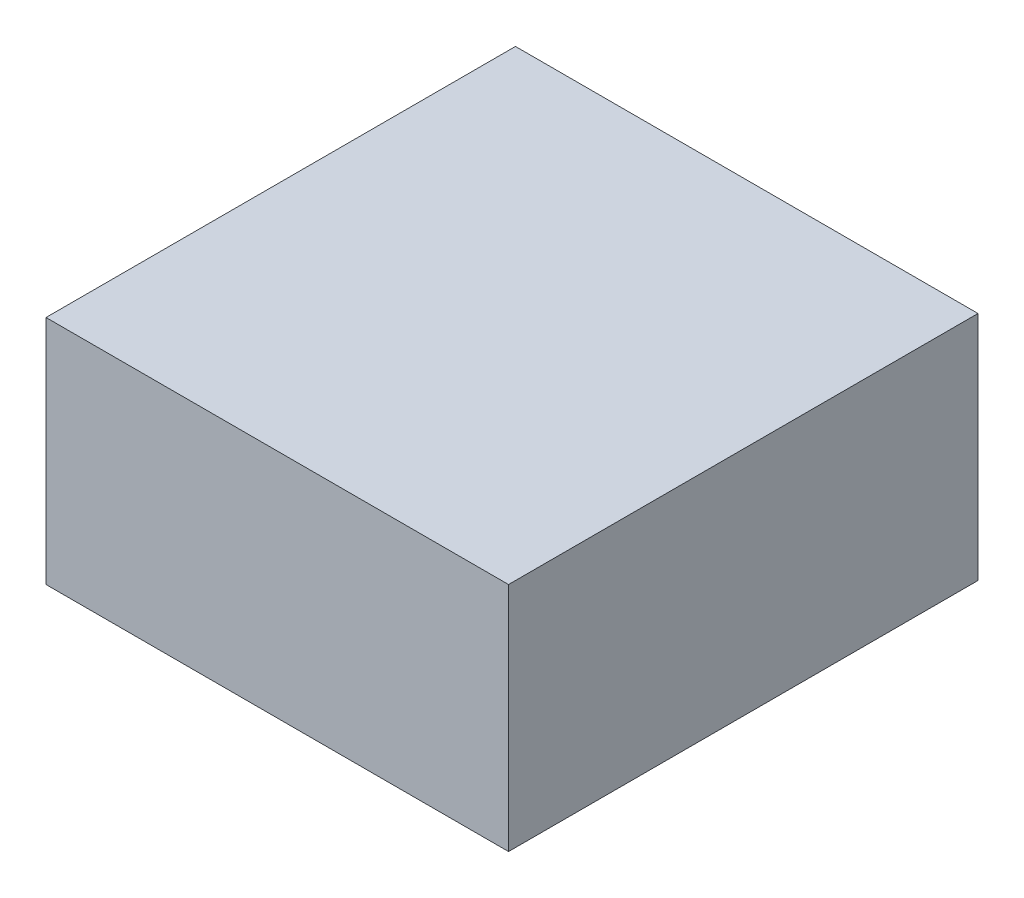
ISO-10303-21;
HEADER;
FILE_DESCRIPTION(('STEP AP214'),'2;1');
FILE_NAME('part.step','',(''),(''),'','','');
FILE_SCHEMA(('AUTOMOTIVE_DESIGN { 1 0 10303 214 1 1 1 1 }'));
ENDSEC;
DATA;
#1=APPLICATION_CONTEXT('core data for automotive mechanical design processes');
#2=APPLICATION_PROTOCOL_DEFINITION('international standard','automotive_design',2000,#1);
#3=PRODUCT_CONTEXT('',#1,'mechanical');
#4=PRODUCT('Part','Part','',(#3));
#5=PRODUCT_RELATED_PRODUCT_CATEGORY('part','',(#4));
#6=PRODUCT_DEFINITION_FORMATION('','',#4);
#7=PRODUCT_DEFINITION_CONTEXT('part definition',#1,'design');
#8=PRODUCT_DEFINITION('design','',#6,#7);
#9=PRODUCT_DEFINITION_SHAPE('','',#8);
#10=(LENGTH_UNIT() NAMED_UNIT(*) SI_UNIT(.MILLI.,.METRE.));
#11=(NAMED_UNIT(*) PLANE_ANGLE_UNIT() SI_UNIT($,.RADIAN.));
#12=(NAMED_UNIT(*) SI_UNIT($,.STERADIAN.) SOLID_ANGLE_UNIT());
#13=UNCERTAINTY_MEASURE_WITH_UNIT(LENGTH_MEASURE(1.E-05),#10,'distance_accuracy_value','');
#14=(GEOMETRIC_REPRESENTATION_CONTEXT(3) GLOBAL_UNCERTAINTY_ASSIGNED_CONTEXT((#13)) GLOBAL_UNIT_ASSIGNED_CONTEXT((#10,
#11,#12)) REPRESENTATION_CONTEXT('',''));
#15=CARTESIAN_POINT('',(0.,0.,0.));
#16=DIRECTION('',(0.,0.,1.));
#17=DIRECTION('',(1.,0.,0.));
#18=AXIS2_PLACEMENT_3D('',#15,#16,#17);
#19=CARTESIAN_POINT('',(-100.,50.,203.));
#20=DIRECTION('',(1.,0.,0.));
#21=DIRECTION('',(0.,1.,0.));
#22=AXIS2_PLACEMENT_3D('',#19,#20,#21);
#23=PLANE('',#22);
#24=DIRECTION('',(0.,-1.,0.));
#25=VECTOR('',#24,1.);
#26=CARTESIAN_POINT('',(-100.,50.,0.));
#27=LINE('',#26,#25);
#28=CARTESIAN_POINT('',(-100.,50.,0.));
#29=VERTEX_POINT('',#28);
#30=CARTESIAN_POINT('',(-100.,-50.,0.));
#31=VERTEX_POINT('',#30);
#32=EDGE_CURVE('E102',#29,#31,#27,.T.);
#33=ORIENTED_EDGE('',*,*,#32,.T.);
#34=DIRECTION('',(0.,0.,-1.));
#35=VECTOR('',#34,1.);
#36=CARTESIAN_POINT('',(-100.,-50.,203.));
#37=LINE('',#36,#35);
#38=CARTESIAN_POINT('',(-100.,-50.,203.));
#39=VERTEX_POINT('',#38);
#40=EDGE_CURVE('E11',#39,#31,#37,.T.);
#41=ORIENTED_EDGE('',*,*,#40,.F.);
#42=DIRECTION('',(0.,-1.,0.));
#43=VECTOR('',#42,1.);
#44=CARTESIAN_POINT('',(-100.,50.,203.));
#45=LINE('',#44,#43);
#46=CARTESIAN_POINT('',(-100.,50.,203.));
#47=VERTEX_POINT('',#46);
#48=EDGE_CURVE('E90',#47,#39,#45,.T.);
#49=ORIENTED_EDGE('',*,*,#48,.F.);
#50=DIRECTION('',(0.,0.,-1.));
#51=VECTOR('',#50,1.);
#52=CARTESIAN_POINT('',(-100.,50.,203.));
#53=LINE('',#52,#51);
#54=EDGE_CURVE('E98',#47,#29,#53,.T.);
#55=ORIENTED_EDGE('',*,*,#54,.T.);
#56=EDGE_LOOP('',(#33,#41,#49,#55));
#57=FACE_BOUND('',#56,.T.);
#58=ADVANCED_FACE('F39',(#57),#23,.F.);
#59=CARTESIAN_POINT('',(-100.,-50.,203.));
#60=DIRECTION('',(0.,1.,0.));
#61=DIRECTION('',(0.,0.,1.));
#62=AXIS2_PLACEMENT_3D('',#59,#60,#61);
#63=PLANE('',#62);
#64=DIRECTION('',(1.,0.,0.));
#65=VECTOR('',#64,1.);
#66=CARTESIAN_POINT('',(-100.,-50.,0.));
#67=LINE('',#66,#65);
#68=CARTESIAN_POINT('',(100.,-50.,0.));
#69=VERTEX_POINT('',#68);
#70=EDGE_CURVE('E94',#31,#69,#67,.T.);
#71=ORIENTED_EDGE('',*,*,#70,.T.);
#72=DIRECTION('',(0.,0.,-1.));
#73=VECTOR('',#72,1.);
#74=CARTESIAN_POINT('',(100.,-50.,203.));
#75=LINE('',#74,#73);
#76=CARTESIAN_POINT('',(100.,-50.,203.));
#77=VERTEX_POINT('',#76);
#78=EDGE_CURVE('E47',#77,#69,#75,.T.);
#79=ORIENTED_EDGE('',*,*,#78,.F.);
#80=DIRECTION('',(1.,0.,0.));
#81=VECTOR('',#80,1.);
#82=CARTESIAN_POINT('',(-100.,-50.,203.));
#83=LINE('',#82,#81);
#84=EDGE_CURVE('E85',#39,#77,#83,.T.);
#85=ORIENTED_EDGE('',*,*,#84,.F.);
#86=ORIENTED_EDGE('',*,*,#40,.T.);
#87=EDGE_LOOP('',(#71,#79,#85,#86));
#88=FACE_BOUND('',#87,.T.);
#89=ADVANCED_FACE('F93',(#88),#63,.F.);
#90=CARTESIAN_POINT('',(100.,50.,203.));
#91=DIRECTION('',(-1.,0.,0.));
#92=DIRECTION('',(0.,-1.,0.));
#93=AXIS2_PLACEMENT_3D('',#90,#91,#92);
#94=PLANE('',#93);
#95=DIRECTION('',(0.,1.,0.));
#96=VECTOR('',#95,1.);
#97=CARTESIAN_POINT('',(100.,50.,0.));
#98=LINE('',#97,#96);
#99=CARTESIAN_POINT('',(100.,50.,0.));
#100=VERTEX_POINT('',#99);
#101=EDGE_CURVE('E72',#69,#100,#98,.T.);
#102=ORIENTED_EDGE('',*,*,#101,.T.);
#103=DIRECTION('',(0.,0.,-1.));
#104=VECTOR('',#103,1.);
#105=CARTESIAN_POINT('',(100.,50.,203.));
#106=LINE('',#105,#104);
#107=CARTESIAN_POINT('',(100.,50.,203.));
#108=VERTEX_POINT('',#107);
#109=EDGE_CURVE('E95',#108,#100,#106,.T.);
#110=ORIENTED_EDGE('',*,*,#109,.F.);
#111=DIRECTION('',(0.,1.,0.));
#112=VECTOR('',#111,1.);
#113=CARTESIAN_POINT('',(100.,50.,203.));
#114=LINE('',#113,#112);
#115=EDGE_CURVE('E88',#77,#108,#114,.T.);
#116=ORIENTED_EDGE('',*,*,#115,.F.);
#117=ORIENTED_EDGE('',*,*,#78,.T.);
#118=EDGE_LOOP('',(#102,#110,#116,#117));
#119=FACE_BOUND('',#118,.T.);
#120=ADVANCED_FACE('F96',(#119),#94,.F.);
#121=CARTESIAN_POINT('',(-100.,50.,203.));
#122=DIRECTION('',(0.,-1.,0.));
#123=DIRECTION('',(0.,0.,-1.));
#124=AXIS2_PLACEMENT_3D('',#121,#122,#123);
#125=PLANE('',#124);
#126=DIRECTION('',(-1.,0.,0.));
#127=VECTOR('',#126,1.);
#128=CARTESIAN_POINT('',(-100.,50.,0.));
#129=LINE('',#128,#127);
#130=EDGE_CURVE('E78',#100,#29,#129,.T.);
#131=ORIENTED_EDGE('',*,*,#130,.T.);
#132=ORIENTED_EDGE('',*,*,#54,.F.);
#133=DIRECTION('',(-1.,0.,0.));
#134=VECTOR('',#133,1.);
#135=CARTESIAN_POINT('',(-100.,50.,203.));
#136=LINE('',#135,#134);
#137=EDGE_CURVE('E55',#108,#47,#136,.T.);
#138=ORIENTED_EDGE('',*,*,#137,.F.);
#139=ORIENTED_EDGE('',*,*,#109,.T.);
#140=EDGE_LOOP('',(#131,#132,#138,#139));
#141=FACE_BOUND('',#140,.T.);
#142=ADVANCED_FACE('F109',(#141),#125,.F.);
#143=CARTESIAN_POINT('',(0.,0.,203.));
#144=DIRECTION('',(0.,0.,1.));
#145=DIRECTION('',(1.,0.,0.));
#146=AXIS2_PLACEMENT_3D('',#143,#144,#145);
#147=PLANE('',#146);
#148=ORIENTED_EDGE('',*,*,#48,.T.);
#149=ORIENTED_EDGE('',*,*,#84,.T.);
#150=ORIENTED_EDGE('',*,*,#115,.T.);
#151=ORIENTED_EDGE('',*,*,#137,.T.);
#152=EDGE_LOOP('',(#148,#149,#150,#151));
#153=FACE_BOUND('',#152,.T.);
#154=ADVANCED_FACE('F86',(#153),#147,.T.);
#155=CARTESIAN_POINT('',(0.,0.,0.));
#156=DIRECTION('',(0.,0.,1.));
#157=DIRECTION('',(1.,0.,0.));
#158=AXIS2_PLACEMENT_3D('',#155,#156,#157);
#159=PLANE('',#158);
#160=ORIENTED_EDGE('',*,*,#32,.F.);
#161=ORIENTED_EDGE('',*,*,#130,.F.);
#162=ORIENTED_EDGE('',*,*,#101,.F.);
#163=ORIENTED_EDGE('',*,*,#70,.F.);
#164=EDGE_LOOP('',(#160,#161,#162,#163));
#165=FACE_BOUND('',#164,.T.);
#166=ADVANCED_FACE('F112',(#165),#159,.F.);
#167=CLOSED_SHELL('',(#58,#89,#120,#142,#154,#166));
#168=MANIFOLD_SOLID_BREP('B2',#167);
#169=ADVANCED_BREP_SHAPE_REPRESENTATION('',(#18,#168),#14);
#170=SHAPE_DEFINITION_REPRESENTATION(#9,#169);
ENDSEC;
END-ISO-10303-21;
